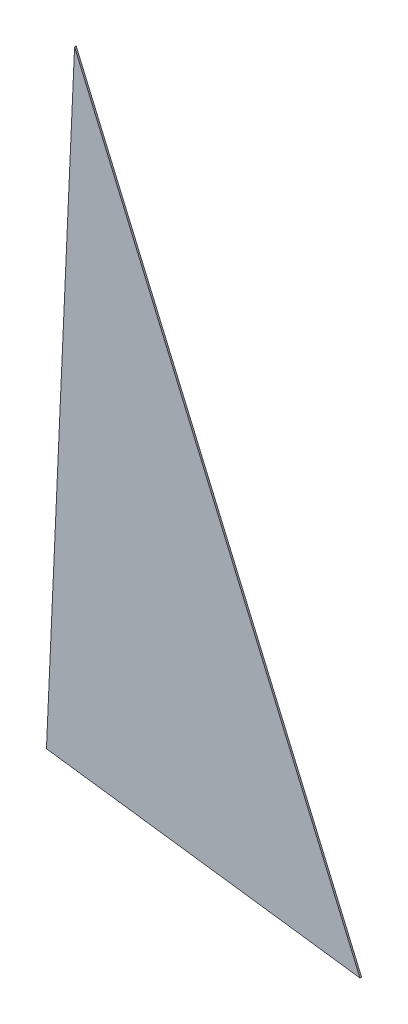
ISO-10303-21;
HEADER;
FILE_DESCRIPTION(('STEP AP214'),'2;1');
FILE_NAME('part.step','',(''),(''),'','','');
FILE_SCHEMA(('AUTOMOTIVE_DESIGN { 1 0 10303 214 1 1 1 1 }'));
ENDSEC;
DATA;
#1=APPLICATION_CONTEXT('core data for automotive mechanical design processes');
#2=APPLICATION_PROTOCOL_DEFINITION('international standard','automotive_design',2000,#1);
#3=PRODUCT_CONTEXT('',#1,'mechanical');
#4=PRODUCT('Part','Part','',(#3));
#5=PRODUCT_RELATED_PRODUCT_CATEGORY('part','',(#4));
#6=PRODUCT_DEFINITION_FORMATION('','',#4);
#7=PRODUCT_DEFINITION_CONTEXT('part definition',#1,'design');
#8=PRODUCT_DEFINITION('design','',#6,#7);
#9=PRODUCT_DEFINITION_SHAPE('','',#8);
#10=(LENGTH_UNIT() NAMED_UNIT(*) SI_UNIT(.MILLI.,.METRE.));
#11=(NAMED_UNIT(*) PLANE_ANGLE_UNIT() SI_UNIT($,.RADIAN.));
#12=(NAMED_UNIT(*) SI_UNIT($,.STERADIAN.) SOLID_ANGLE_UNIT());
#13=UNCERTAINTY_MEASURE_WITH_UNIT(LENGTH_MEASURE(1.E-05),#10,'distance_accuracy_value','');
#14=(GEOMETRIC_REPRESENTATION_CONTEXT(3) GLOBAL_UNCERTAINTY_ASSIGNED_CONTEXT((#13)) GLOBAL_UNIT_ASSIGNED_CONTEXT((#10,
#11,#12)) REPRESENTATION_CONTEXT('',''));
#15=CARTESIAN_POINT('',(0.,0.,0.));
#16=DIRECTION('',(0.,0.,1.));
#17=DIRECTION('',(1.,0.,0.));
#18=AXIS2_PLACEMENT_3D('',#15,#16,#17);
#19=CARTESIAN_POINT('',(56.2082587071112,-462.278740131326,1.5));
#20=DIRECTION('',(0.998977842513023,-0.0452025460347752,0.));
#21=DIRECTION('',(0.0452025460347752,0.998977842513023,0.));
#22=AXIS2_PLACEMENT_3D('',#19,#20,#21);
#23=PLANE('',#22);
#24=DIRECTION('',(-0.0452025460347752,-0.998977842513023,0.));
#25=VECTOR('',#24,1.);
#26=CARTESIAN_POINT('',(56.2082587071112,-462.278740131326,0.));
#27=LINE('',#26,#25);
#28=CARTESIAN_POINT('',(90.1101682331926,286.954641753441,0.));
#29=VERTEX_POINT('',#28);
#30=CARTESIAN_POINT('',(63.8221682810832,-294.011073229461,0.));
#31=VERTEX_POINT('',#30);
#32=EDGE_CURVE('E83',#29,#31,#27,.T.);
#33=ORIENTED_EDGE('',*,*,#32,.T.);
#34=DIRECTION('',(0.,0.,-1.));
#35=VECTOR('',#34,1.);
#36=CARTESIAN_POINT('',(63.8221682810832,-294.011073229461,10.));
#37=LINE('',#36,#35);
#38=CARTESIAN_POINT('',(63.8221682810832,-294.011073229461,1.5));
#39=VERTEX_POINT('',#38);
#40=EDGE_CURVE('E52',#39,#31,#37,.T.);
#41=ORIENTED_EDGE('',*,*,#40,.F.);
#42=DIRECTION('',(-0.0452025460347752,-0.998977842513023,0.));
#43=VECTOR('',#42,1.);
#44=CARTESIAN_POINT('',(56.2082587071112,-462.278740131326,1.5));
#45=LINE('',#44,#43);
#46=CARTESIAN_POINT('',(90.1101682331926,286.954641753441,1.5));
#47=VERTEX_POINT('',#46);
#48=EDGE_CURVE('E84',#47,#39,#45,.T.);
#49=ORIENTED_EDGE('',*,*,#48,.F.);
#50=DIRECTION('',(0.,0.,-1.));
#51=VECTOR('',#50,1.);
#52=CARTESIAN_POINT('',(90.1101682331926,286.954641753441,1.5));
#53=LINE('',#52,#51);
#54=EDGE_CURVE('E45',#47,#29,#53,.T.);
#55=ORIENTED_EDGE('',*,*,#54,.T.);
#56=EDGE_LOOP('',(#33,#41,#49,#55));
#57=FACE_BOUND('',#56,.T.);
#58=ADVANCED_FACE('F38',(#57),#23,.F.);
#59=CARTESIAN_POINT('',(90.1101682331926,286.954641753441,1.5));
#60=DIRECTION('',(-0.918658864187895,-0.395051757683733,0.));
#61=DIRECTION('',(0.395051757683733,-0.918658864187895,0.));
#62=AXIS2_PLACEMENT_3D('',#59,#60,#61);
#63=PLANE('',#62);
#64=DIRECTION('',(-0.395051757683733,0.918658864187895,0.));
#65=VECTOR('',#64,1.);
#66=CARTESIAN_POINT('',(90.1101682331926,286.954641753441,0.));
#67=LINE('',#66,#65);
#68=CARTESIAN_POINT('',(356.729366405778,-333.045358246559,0.));
#69=VERTEX_POINT('',#68);
#70=EDGE_CURVE('E80',#69,#29,#67,.T.);
#71=ORIENTED_EDGE('',*,*,#70,.T.);
#72=ORIENTED_EDGE('',*,*,#54,.F.);
#73=DIRECTION('',(-0.395051757683733,0.918658864187895,0.));
#74=VECTOR('',#73,1.);
#75=CARTESIAN_POINT('',(90.1101682331926,286.954641753441,1.5));
#76=LINE('',#75,#74);
#77=CARTESIAN_POINT('',(356.729366405778,-333.045358246559,1.5));
#78=VERTEX_POINT('',#77);
#79=EDGE_CURVE('E61',#78,#47,#76,.T.);
#80=ORIENTED_EDGE('',*,*,#79,.F.);
#81=DIRECTION('',(0.,0.,-1.));
#82=VECTOR('',#81,1.);
#83=CARTESIAN_POINT('',(356.729366405778,-333.045358246559,1.5));
#84=LINE('',#83,#82);
#85=EDGE_CURVE('E11',#78,#69,#84,.T.);
#86=ORIENTED_EDGE('',*,*,#85,.T.);
#87=EDGE_LOOP('',(#71,#72,#80,#86));
#88=FACE_BOUND('',#87,.T.);
#89=ADVANCED_FACE('F79',(#88),#63,.F.);
#90=CARTESIAN_POINT('',(0.,0.,1.5));
#91=DIRECTION('',(0.,0.,1.));
#92=DIRECTION('',(1.,0.,0.));
#93=AXIS2_PLACEMENT_3D('',#90,#91,#92);
#94=PLANE('',#93);
#95=DIRECTION('',(-0.991236768748858,0.13209719255277,0.));
#96=VECTOR('',#95,1.);
#97=CARTESIAN_POINT('',(-37.3840149849377,-280.523828708359,1.5));
#98=LINE('',#97,#96);
#99=EDGE_CURVE('E87',#78,#39,#98,.T.);
#100=ORIENTED_EDGE('',*,*,#99,.F.);
#101=ORIENTED_EDGE('',*,*,#79,.T.);
#102=ORIENTED_EDGE('',*,*,#48,.T.);
#103=EDGE_LOOP('',(#100,#101,#102));
#104=FACE_BOUND('',#103,.T.);
#105=ADVANCED_FACE('F94',(#104),#94,.T.);
#106=CARTESIAN_POINT('',(0.,0.,0.));
#107=DIRECTION('',(0.,0.,1.));
#108=DIRECTION('',(1.,0.,0.));
#109=AXIS2_PLACEMENT_3D('',#106,#107,#108);
#110=PLANE('',#109);
#111=ORIENTED_EDGE('',*,*,#70,.F.);
#112=DIRECTION('',(0.991236768748858,-0.13209719255277,0.));
#113=VECTOR('',#112,1.);
#114=CARTESIAN_POINT('',(356.729366405778,-333.045358246559,0.));
#115=LINE('',#114,#113);
#116=EDGE_CURVE('E71',#31,#69,#115,.T.);
#117=ORIENTED_EDGE('',*,*,#116,.F.);
#118=ORIENTED_EDGE('',*,*,#32,.F.);
#119=EDGE_LOOP('',(#111,#117,#118));
#120=FACE_BOUND('',#119,.T.);
#121=ADVANCED_FACE('F82',(#120),#110,.F.);
#122=CARTESIAN_POINT('',(356.729366405778,-333.045358246559,10.));
#123=DIRECTION('',(0.13209719255277,0.991236768748858,0.));
#124=DIRECTION('',(-0.991236768748858,0.13209719255277,0.));
#125=AXIS2_PLACEMENT_3D('',#122,#123,#124);
#126=PLANE('',#125);
#127=ORIENTED_EDGE('',*,*,#99,.T.);
#128=ORIENTED_EDGE('',*,*,#40,.T.);
#129=ORIENTED_EDGE('',*,*,#116,.T.);
#130=ORIENTED_EDGE('',*,*,#85,.F.);
#131=EDGE_LOOP('',(#127,#128,#129,#130));
#132=FACE_BOUND('',#131,.T.);
#133=ADVANCED_FACE('F72',(#132),#126,.F.);
#134=CLOSED_SHELL('',(#58,#89,#105,#121,#133));
#135=MANIFOLD_SOLID_BREP('B2',#134);
#136=ADVANCED_BREP_SHAPE_REPRESENTATION('',(#18,#135),#14);
#137=SHAPE_DEFINITION_REPRESENTATION(#9,#136);
ENDSEC;
END-ISO-10303-21;
